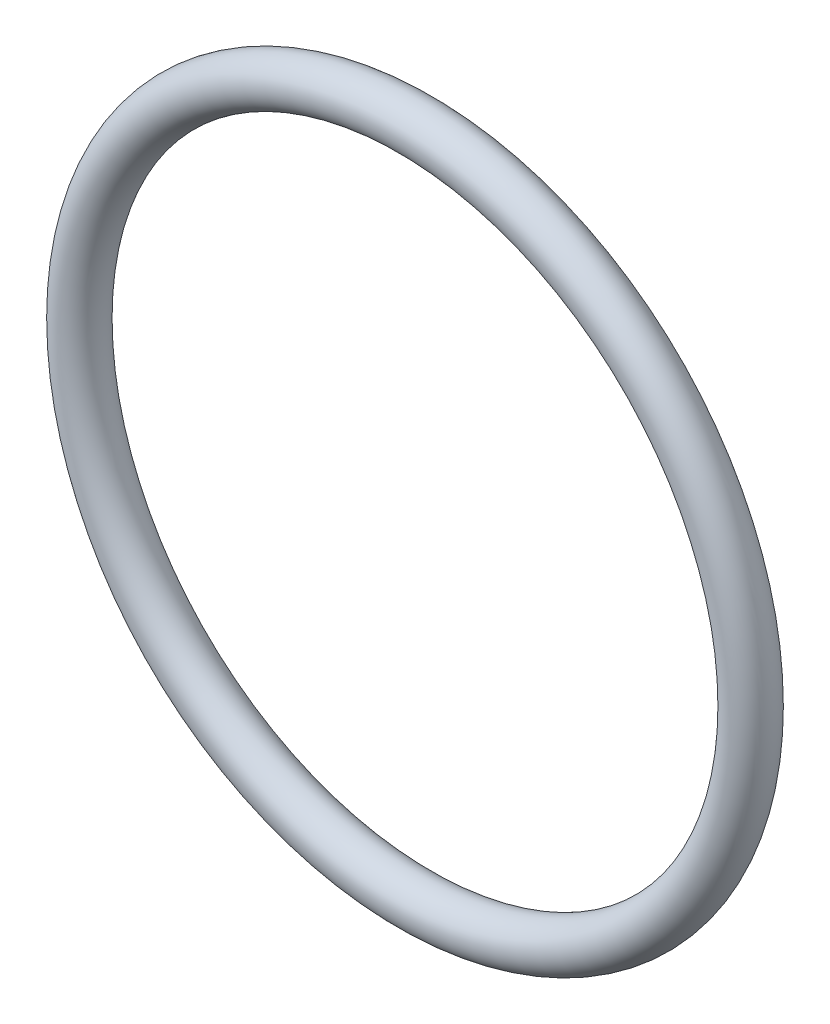
ISO-10303-21;
HEADER;
FILE_DESCRIPTION(('STEP AP214'),'2;1');
FILE_NAME('part.step','',(''),(''),'','','');
FILE_SCHEMA(('AUTOMOTIVE_DESIGN { 1 0 10303 214 1 1 1 1 }'));
ENDSEC;
DATA;
#1=APPLICATION_CONTEXT('core data for automotive mechanical design processes');
#2=APPLICATION_PROTOCOL_DEFINITION('international standard','automotive_design',2000,#1);
#3=PRODUCT_CONTEXT('',#1,'mechanical');
#4=PRODUCT('Part','Part','',(#3));
#5=PRODUCT_RELATED_PRODUCT_CATEGORY('part','',(#4));
#6=PRODUCT_DEFINITION_FORMATION('','',#4);
#7=PRODUCT_DEFINITION_CONTEXT('part definition',#1,'design');
#8=PRODUCT_DEFINITION('design','',#6,#7);
#9=PRODUCT_DEFINITION_SHAPE('','',#8);
#10=(LENGTH_UNIT() NAMED_UNIT(*) SI_UNIT(.MILLI.,.METRE.));
#11=(NAMED_UNIT(*) PLANE_ANGLE_UNIT() SI_UNIT($,.RADIAN.));
#12=(NAMED_UNIT(*) SI_UNIT($,.STERADIAN.) SOLID_ANGLE_UNIT());
#13=UNCERTAINTY_MEASURE_WITH_UNIT(LENGTH_MEASURE(1.E-05),#10,'distance_accuracy_value','');
#14=(GEOMETRIC_REPRESENTATION_CONTEXT(3) GLOBAL_UNCERTAINTY_ASSIGNED_CONTEXT((#13)) GLOBAL_UNIT_ASSIGNED_CONTEXT((#10,
#11,#12)) REPRESENTATION_CONTEXT('',''));
#15=CARTESIAN_POINT('',(0.,0.,0.));
#16=DIRECTION('',(0.,0.,1.));
#17=DIRECTION('',(1.,0.,0.));
#18=AXIS2_PLACEMENT_3D('',#15,#16,#17);
#19=CARTESIAN_POINT('',(0.,0.,0.));
#20=DIRECTION('',(0.,0.,1.));
#21=DIRECTION('',(1.,0.,0.));
#22=AXIS2_PLACEMENT_3D('',#19,#20,#21);
#23=TOROIDAL_SURFACE('',#22,29.,2.);
#24=CARTESIAN_POINT('',(-29.,0.,0.));
#25=DIRECTION('',(0.,1.,0.));
#26=DIRECTION('',(0.,0.,1.));
#27=AXIS2_PLACEMENT_3D('',#24,#25,#26);
#28=CIRCLE('',#27,2.);
#29=CARTESIAN_POINT('',(-31.,0.,0.));
#30=VERTEX_POINT('',#29);
#31=EDGE_CURVE('E10',#30,#30,#28,.T.);
#32=CARTESIAN_POINT('',(0.,0.,0.));
#33=DIRECTION('',(0.,0.,1.));
#34=DIRECTION('',(1.,0.,0.));
#35=AXIS2_PLACEMENT_3D('',#32,#33,#34);
#36=CIRCLE('',#35,31.);
#37=EDGE_CURVE('',#30,#30,#36,.T.);
#38=ORIENTED_EDGE('',*,*,#31,.F.);
#39=ORIENTED_EDGE('',*,*,#31,.T.);
#40=ORIENTED_EDGE('',*,*,#37,.T.);
#41=ORIENTED_EDGE('',*,*,#37,.F.);
#42=EDGE_LOOP('',(#38,#40,#39,#41));
#43=FACE_BOUND('',#42,.T.);
#44=ADVANCED_FACE('F37',(#43),#23,.T.);
#45=CLOSED_SHELL('',(#44));
#46=MANIFOLD_SOLID_BREP('B2',#45);
#47=ADVANCED_BREP_SHAPE_REPRESENTATION('',(#18,#46),#14);
#48=SHAPE_DEFINITION_REPRESENTATION(#9,#47);
ENDSEC;
END-ISO-10303-21;
